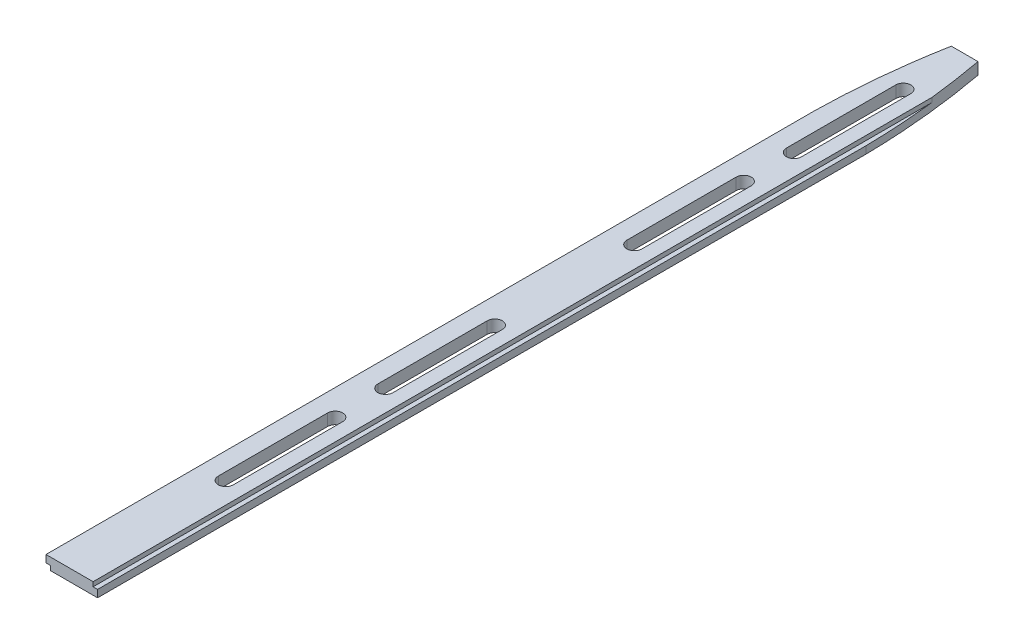
ISO-10303-21;
HEADER;
FILE_DESCRIPTION(('STEP AP214'),'2;1');
FILE_NAME('part.step','',(''),(''),'','','');
FILE_SCHEMA(('AUTOMOTIVE_DESIGN { 1 0 10303 214 1 1 1 1 }'));
ENDSEC;
DATA;
#1=APPLICATION_CONTEXT('core data for automotive mechanical design processes');
#2=APPLICATION_PROTOCOL_DEFINITION('international standard','automotive_design',2000,#1);
#3=PRODUCT_CONTEXT('',#1,'mechanical');
#4=PRODUCT('Part','Part','',(#3));
#5=PRODUCT_RELATED_PRODUCT_CATEGORY('part','',(#4));
#6=PRODUCT_DEFINITION_FORMATION('','',#4);
#7=PRODUCT_DEFINITION_CONTEXT('part definition',#1,'design');
#8=PRODUCT_DEFINITION('design','',#6,#7);
#9=PRODUCT_DEFINITION_SHAPE('','',#8);
#10=(LENGTH_UNIT() NAMED_UNIT(*) SI_UNIT(.MILLI.,.METRE.));
#11=(NAMED_UNIT(*) PLANE_ANGLE_UNIT() SI_UNIT($,.RADIAN.));
#12=(NAMED_UNIT(*) SI_UNIT($,.STERADIAN.) SOLID_ANGLE_UNIT());
#13=UNCERTAINTY_MEASURE_WITH_UNIT(LENGTH_MEASURE(1.E-05),#10,'distance_accuracy_value','');
#14=(GEOMETRIC_REPRESENTATION_CONTEXT(3) GLOBAL_UNCERTAINTY_ASSIGNED_CONTEXT((#13)) GLOBAL_UNIT_ASSIGNED_CONTEXT((#10,
#11,#12)) REPRESENTATION_CONTEXT('',''));
#15=CARTESIAN_POINT('',(0.,0.,0.));
#16=DIRECTION('',(0.,0.,1.));
#17=DIRECTION('',(1.,0.,0.));
#18=AXIS2_PLACEMENT_3D('',#15,#16,#17);
#19=CARTESIAN_POINT('',(0.,0.,401.7));
#20=DIRECTION('',(1.,0.,0.));
#21=DIRECTION('',(0.,0.,-1.));
#22=AXIS2_PLACEMENT_3D('',#19,#20,#21);
#23=PLANE('',#22);
#24=DIRECTION('',(0.,0.,1.));
#25=VECTOR('',#24,1.);
#26=CARTESIAN_POINT('',(0.,6.3,-1.));
#27=LINE('',#26,#25);
#28=CARTESIAN_POINT('',(0.,6.3,56.));
#29=VERTEX_POINT('',#28);
#30=CARTESIAN_POINT('',(0.,6.3,401.7));
#31=VERTEX_POINT('',#30);
#32=EDGE_CURVE('E496',#29,#31,#27,.T.);
#33=ORIENTED_EDGE('',*,*,#32,.F.);
#34=DIRECTION('',(0.,1.,0.));
#35=VECTOR('',#34,1.);
#36=CARTESIAN_POINT('',(0.,-396.4,56.));
#37=LINE('',#36,#35);
#38=CARTESIAN_POINT('',(0.,3.,56.));
#39=VERTEX_POINT('',#38);
#40=EDGE_CURVE('E442',#39,#29,#37,.T.);
#41=ORIENTED_EDGE('',*,*,#40,.F.);
#42=DIRECTION('',(0.,0.,1.));
#43=VECTOR('',#42,1.);
#44=CARTESIAN_POINT('',(0.,3.,-1.));
#45=LINE('',#44,#43);
#46=CARTESIAN_POINT('',(0.,3.,401.7));
#47=VERTEX_POINT('',#46);
#48=EDGE_CURVE('E479',#39,#47,#45,.T.);
#49=ORIENTED_EDGE('',*,*,#48,.T.);
#50=DIRECTION('',(0.,-1.,0.));
#51=VECTOR('',#50,1.);
#52=CARTESIAN_POINT('',(0.,0.,401.7));
#53=LINE('',#52,#51);
#54=EDGE_CURVE('E500',#31,#47,#53,.T.);
#55=ORIENTED_EDGE('',*,*,#54,.F.);
#56=EDGE_LOOP('',(#33,#41,#49,#55));
#57=FACE_BOUND('',#56,.T.);
#58=ADVANCED_FACE('F43',(#57),#23,.F.);
#59=CARTESIAN_POINT('',(23.2,0.,401.7));
#60=DIRECTION('',(-1.,0.,0.));
#61=DIRECTION('',(0.,0.,1.));
#62=AXIS2_PLACEMENT_3D('',#59,#60,#61);
#63=PLANE('',#62);
#64=DIRECTION('',(0.,0.,1.));
#65=VECTOR('',#64,1.);
#66=CARTESIAN_POINT('',(23.2,1.,-1.));
#67=LINE('',#66,#65);
#68=CARTESIAN_POINT('',(23.2,1.,56.));
#69=VERTEX_POINT('',#68);
#70=CARTESIAN_POINT('',(23.2,1.,401.7));
#71=VERTEX_POINT('',#70);
#72=EDGE_CURVE('E509',#69,#71,#67,.T.);
#73=ORIENTED_EDGE('',*,*,#72,.F.);
#74=DIRECTION('',(0.,1.,0.));
#75=VECTOR('',#74,1.);
#76=CARTESIAN_POINT('',(23.2,-396.4,56.));
#77=LINE('',#76,#75);
#78=CARTESIAN_POINT('',(23.2,4.30000000000003,56.));
#79=VERTEX_POINT('',#78);
#80=EDGE_CURVE('E552',#69,#79,#77,.T.);
#81=ORIENTED_EDGE('',*,*,#80,.T.);
#82=DIRECTION('',(0.,0.,1.));
#83=VECTOR('',#82,1.);
#84=CARTESIAN_POINT('',(23.2,4.3,-1.));
#85=LINE('',#84,#83);
#86=CARTESIAN_POINT('',(23.2,4.3,401.7));
#87=VERTEX_POINT('',#86);
#88=EDGE_CURVE('E497',#79,#87,#85,.T.);
#89=ORIENTED_EDGE('',*,*,#88,.T.);
#90=DIRECTION('',(0.,1.,0.));
#91=VECTOR('',#90,1.);
#92=CARTESIAN_POINT('',(23.2,0.,401.7));
#93=LINE('',#92,#91);
#94=EDGE_CURVE('E534',#71,#87,#93,.T.);
#95=ORIENTED_EDGE('',*,*,#94,.F.);
#96=EDGE_LOOP('',(#73,#81,#89,#95));
#97=FACE_BOUND('',#96,.T.);
#98=ADVANCED_FACE('F582',(#97),#63,.F.);
#99=CARTESIAN_POINT('',(0.,0.,401.7));
#100=DIRECTION('',(0.,0.,-1.));
#101=DIRECTION('',(-1.,0.,0.));
#102=AXIS2_PLACEMENT_3D('',#99,#100,#101);
#103=PLANE('',#102);
#104=ORIENTED_EDGE('',*,*,#94,.T.);
#105=DIRECTION('',(1.,0.,0.));
#106=VECTOR('',#105,1.);
#107=CARTESIAN_POINT('',(21.2,4.3,401.7));
#108=LINE('',#107,#106);
#109=CARTESIAN_POINT('',(21.2,4.3,401.7));
#110=VERTEX_POINT('',#109);
#111=EDGE_CURVE('E492',#110,#87,#108,.T.);
#112=ORIENTED_EDGE('',*,*,#111,.F.);
#113=DIRECTION('',(0.,-1.,0.));
#114=VECTOR('',#113,1.);
#115=CARTESIAN_POINT('',(21.2,6.3,401.7));
#116=LINE('',#115,#114);
#117=CARTESIAN_POINT('',(21.2,6.3,401.7));
#118=VERTEX_POINT('',#117);
#119=EDGE_CURVE('E487',#118,#110,#116,.T.);
#120=ORIENTED_EDGE('',*,*,#119,.F.);
#121=DIRECTION('',(1.,0.,0.));
#122=VECTOR('',#121,1.);
#123=CARTESIAN_POINT('',(0.,6.3,401.7));
#124=LINE('',#123,#122);
#125=EDGE_CURVE('E480',#31,#118,#124,.T.);
#126=ORIENTED_EDGE('',*,*,#125,.F.);
#127=ORIENTED_EDGE('',*,*,#54,.T.);
#128=DIRECTION('',(-1.,0.,0.));
#129=VECTOR('',#128,1.);
#130=CARTESIAN_POINT('',(0.,3.,401.7));
#131=LINE('',#130,#129);
#132=CARTESIAN_POINT('',(2.,3.,401.7));
#133=VERTEX_POINT('',#132);
#134=EDGE_CURVE('E512',#133,#47,#131,.T.);
#135=ORIENTED_EDGE('',*,*,#134,.F.);
#136=DIRECTION('',(0.,1.,0.));
#137=VECTOR('',#136,1.);
#138=CARTESIAN_POINT('',(2.,0.999999999999997,401.7));
#139=LINE('',#138,#137);
#140=CARTESIAN_POINT('',(2.,0.999999999999997,401.7));
#141=VERTEX_POINT('',#140);
#142=EDGE_CURVE('E524',#141,#133,#139,.T.);
#143=ORIENTED_EDGE('',*,*,#142,.F.);
#144=DIRECTION('',(-1.,0.,0.));
#145=VECTOR('',#144,1.);
#146=CARTESIAN_POINT('',(23.2,1.,401.7));
#147=LINE('',#146,#145);
#148=EDGE_CURVE('E488',#71,#141,#147,.T.);
#149=ORIENTED_EDGE('',*,*,#148,.F.);
#150=EDGE_LOOP('',(#104,#112,#120,#126,#127,#135,#143,#149));
#151=FACE_BOUND('',#150,.T.);
#152=ADVANCED_FACE('F570',(#151),#103,.F.);
#153=CARTESIAN_POINT('',(0.,0.,0.));
#154=DIRECTION('',(0.,0.,-1.));
#155=DIRECTION('',(-1.,0.,0.));
#156=AXIS2_PLACEMENT_3D('',#153,#154,#155);
#157=PLANE('',#156);
#158=DIRECTION('',(0.,1.,0.));
#159=VECTOR('',#158,1.);
#160=CARTESIAN_POINT('',(5.6,-396.4,0.));
#161=LINE('',#160,#159);
#162=CARTESIAN_POINT('',(5.6,1.,0.));
#163=VERTEX_POINT('',#162);
#164=CARTESIAN_POINT('',(5.6,6.3,0.));
#165=VERTEX_POINT('',#164);
#166=EDGE_CURVE('E549',#163,#165,#161,.T.);
#167=ORIENTED_EDGE('',*,*,#166,.T.);
#168=DIRECTION('',(-1.,0.,0.));
#169=VECTOR('',#168,1.);
#170=CARTESIAN_POINT('',(0.,6.3,0.));
#171=LINE('',#170,#169);
#172=CARTESIAN_POINT('',(17.6,6.3,0.));
#173=VERTEX_POINT('',#172);
#174=EDGE_CURVE('E11',#173,#165,#171,.T.);
#175=ORIENTED_EDGE('',*,*,#174,.F.);
#176=DIRECTION('',(0.,1.,0.));
#177=VECTOR('',#176,1.);
#178=CARTESIAN_POINT('',(17.6,-396.4,0.));
#179=LINE('',#178,#177);
#180=CARTESIAN_POINT('',(17.6,1.,0.));
#181=VERTEX_POINT('',#180);
#182=EDGE_CURVE('E397',#181,#173,#179,.T.);
#183=ORIENTED_EDGE('',*,*,#182,.F.);
#184=DIRECTION('',(1.,0.,0.));
#185=VECTOR('',#184,1.);
#186=CARTESIAN_POINT('',(0.,0.999999999999997,0.));
#187=LINE('',#186,#185);
#188=EDGE_CURVE('E51',#163,#181,#187,.T.);
#189=ORIENTED_EDGE('',*,*,#188,.F.);
#190=EDGE_LOOP('',(#167,#175,#183,#189));
#191=FACE_BOUND('',#190,.T.);
#192=ADVANCED_FACE('F547',(#191),#157,.T.);
#193=CARTESIAN_POINT('',(0.,3.,-1.));
#194=DIRECTION('',(0.,1.,0.));
#195=DIRECTION('',(0.,0.,1.));
#196=AXIS2_PLACEMENT_3D('',#193,#194,#195);
#197=PLANE('',#196);
#198=ORIENTED_EDGE('',*,*,#48,.F.);
#199=CARTESIAN_POINT('',(0.,3.,56.));
#200=CARTESIAN_POINT('',(0.420625120228415,3.,27.8813271999908));
#201=CARTESIAN_POINT('',(5.6,3.,0.));
#202=B_SPLINE_CURVE_WITH_KNOTS('',2,(#199,#200,#201),.UNSPECIFIED.,.F.,.F.,(3,3),(0.,
0.849776742775546),.UNSPECIFIED.);
#203=CARTESIAN_POINT('',(1.99999999999958,3.,24.2514642715801));
#204=VERTEX_POINT('',#203);
#205=EDGE_CURVE('E473',#39,#204,#202,.T.);
#206=ORIENTED_EDGE('',*,*,#205,.T.);
#207=DIRECTION('',(0.,0.,1.));
#208=VECTOR('',#207,1.);
#209=CARTESIAN_POINT('',(2.,3.,-1.));
#210=LINE('',#209,#208);
#211=EDGE_CURVE('E516',#204,#133,#210,.T.);
#212=ORIENTED_EDGE('',*,*,#211,.T.);
#213=ORIENTED_EDGE('',*,*,#134,.T.);
#214=EDGE_LOOP('',(#198,#206,#212,#213));
#215=FACE_BOUND('',#214,.T.);
#216=ADVANCED_FACE('F588',(#215),#197,.F.);
#217=CARTESIAN_POINT('',(2.,0.999999999999997,-1.));
#218=DIRECTION('',(1.,0.,0.));
#219=DIRECTION('',(0.,1.,0.));
#220=AXIS2_PLACEMENT_3D('',#217,#218,#219);
#221=PLANE('',#220);
#222=ORIENTED_EDGE('',*,*,#211,.F.);
#223=DIRECTION('',(0.,1.,0.));
#224=VECTOR('',#223,1.);
#225=CARTESIAN_POINT('',(1.99999999999958,-396.4,24.2514642715801));
#226=LINE('',#225,#224);
#227=CARTESIAN_POINT('',(1.99999999768843,1.,24.2514642923522));
#228=VERTEX_POINT('',#227);
#229=EDGE_CURVE('E466',#204,#228,#226,.F.);
#230=ORIENTED_EDGE('',*,*,#229,.T.);
#231=DIRECTION('',(0.,0.,1.));
#232=VECTOR('',#231,1.);
#233=CARTESIAN_POINT('',(2.,0.999999999999997,-1.));
#234=LINE('',#233,#232);
#235=EDGE_CURVE('E513',#228,#141,#234,.T.);
#236=ORIENTED_EDGE('',*,*,#235,.T.);
#237=ORIENTED_EDGE('',*,*,#142,.T.);
#238=EDGE_LOOP('',(#222,#230,#236,#237));
#239=FACE_BOUND('',#238,.T.);
#240=ADVANCED_FACE('F586',(#239),#221,.F.);
#241=CARTESIAN_POINT('',(23.2,1.,-1.));
#242=DIRECTION('',(0.,1.,0.));
#243=DIRECTION('',(-1.,0.,0.));
#244=AXIS2_PLACEMENT_3D('',#241,#242,#243);
#245=PLANE('',#244);
#246=DIRECTION('',(0.,0.,-1.));
#247=VECTOR('',#246,1.);
#248=CARTESIAN_POINT('',(15.,0.999999999999999,-1.));
#249=LINE('',#248,#247);
#250=CARTESIAN_POINT('',(15.,1.,76.8));
#251=VERTEX_POINT('',#250);
#252=CARTESIAN_POINT('',(15.,1.,27.6));
#253=VERTEX_POINT('',#252);
#254=EDGE_CURVE('E389',#251,#253,#249,.T.);
#255=ORIENTED_EDGE('',*,*,#254,.T.);
#256=CARTESIAN_POINT('',(11.6,1.,27.6));
#257=DIRECTION('',(0.,1.,0.));
#258=DIRECTION('',(-1.,0.,0.));
#259=AXIS2_PLACEMENT_3D('',#256,#257,#258);
#260=CIRCLE('',#259,3.4);
#261=CARTESIAN_POINT('',(8.2,1.,27.6));
#262=VERTEX_POINT('',#261);
#263=EDGE_CURVE('E393',#253,#262,#260,.T.);
#264=ORIENTED_EDGE('',*,*,#263,.T.);
#265=DIRECTION('',(0.,0.,1.));
#266=VECTOR('',#265,1.);
#267=CARTESIAN_POINT('',(8.2,0.999999999999998,-1.));
#268=LINE('',#267,#266);
#269=CARTESIAN_POINT('',(8.2,0.999999999999998,76.8));
#270=VERTEX_POINT('',#269);
#271=EDGE_CURVE('E384',#262,#270,#268,.T.);
#272=ORIENTED_EDGE('',*,*,#271,.T.);
#273=CARTESIAN_POINT('',(11.6,1.,76.8));
#274=DIRECTION('',(0.,1.,0.));
#275=DIRECTION('',(-1.,0.,0.));
#276=AXIS2_PLACEMENT_3D('',#273,#274,#275);
#277=CIRCLE('',#276,3.4);
#278=EDGE_CURVE('E221',#270,#251,#277,.T.);
#279=ORIENTED_EDGE('',*,*,#278,.T.);
#280=EDGE_LOOP('',(#255,#264,#272,#279));
#281=FACE_BOUND('',#280,.T.);
#282=DIRECTION('',(0.,0.,-1.));
#283=VECTOR('',#282,1.);
#284=CARTESIAN_POINT('',(15.,0.999999999999999,-0.999999999999999));
#285=LINE('',#284,#283);
#286=CARTESIAN_POINT('',(15.,1.,148.6));
#287=VERTEX_POINT('',#286);
#288=CARTESIAN_POINT('',(15.,1.,99.4));
#289=VERTEX_POINT('',#288);
#290=EDGE_CURVE('E376',#287,#289,#285,.T.);
#291=ORIENTED_EDGE('',*,*,#290,.T.);
#292=CARTESIAN_POINT('',(11.6,1.,99.4));
#293=DIRECTION('',(0.,1.,0.));
#294=DIRECTION('',(-1.,0.,0.));
#295=AXIS2_PLACEMENT_3D('',#292,#293,#294);
#296=CIRCLE('',#295,3.4);
#297=CARTESIAN_POINT('',(8.2,1.,99.4));
#298=VERTEX_POINT('',#297);
#299=EDGE_CURVE('E380',#289,#298,#296,.T.);
#300=ORIENTED_EDGE('',*,*,#299,.T.);
#301=DIRECTION('',(0.,0.,1.));
#302=VECTOR('',#301,1.);
#303=CARTESIAN_POINT('',(8.20000000000001,0.999999999999998,-1.));
#304=LINE('',#303,#302);
#305=CARTESIAN_POINT('',(8.2,0.999999999999998,148.6));
#306=VERTEX_POINT('',#305);
#307=EDGE_CURVE('E368',#298,#306,#304,.T.);
#308=ORIENTED_EDGE('',*,*,#307,.T.);
#309=CARTESIAN_POINT('',(11.6,1.,148.6));
#310=DIRECTION('',(0.,1.,0.));
#311=DIRECTION('',(-1.,0.,0.));
#312=AXIS2_PLACEMENT_3D('',#309,#310,#311);
#313=CIRCLE('',#312,3.40000000000001);
#314=EDGE_CURVE('E372',#306,#287,#313,.T.);
#315=ORIENTED_EDGE('',*,*,#314,.T.);
#316=EDGE_LOOP('',(#291,#300,#308,#315));
#317=FACE_BOUND('',#316,.T.);
#318=DIRECTION('',(0.,0.,-1.));
#319=VECTOR('',#318,1.);
#320=CARTESIAN_POINT('',(15.,0.999999999999999,-1.));
#321=LINE('',#320,#319);
#322=CARTESIAN_POINT('',(15.,1.,260.6));
#323=VERTEX_POINT('',#322);
#324=CARTESIAN_POINT('',(15.,1.,211.4));
#325=VERTEX_POINT('',#324);
#326=EDGE_CURVE('E360',#323,#325,#321,.T.);
#327=ORIENTED_EDGE('',*,*,#326,.T.);
#328=CARTESIAN_POINT('',(11.6,1.,211.4));
#329=DIRECTION('',(0.,1.,0.));
#330=DIRECTION('',(-1.,0.,0.));
#331=AXIS2_PLACEMENT_3D('',#328,#329,#330);
#332=CIRCLE('',#331,3.40000000000001);
#333=CARTESIAN_POINT('',(8.2,1.,211.4));
#334=VERTEX_POINT('',#333);
#335=EDGE_CURVE('E364',#325,#334,#332,.T.);
#336=ORIENTED_EDGE('',*,*,#335,.T.);
#337=DIRECTION('',(0.,0.,1.));
#338=VECTOR('',#337,1.);
#339=CARTESIAN_POINT('',(8.2,0.999999999999998,-1.));
#340=LINE('',#339,#338);
#341=CARTESIAN_POINT('',(8.2,0.999999999999998,260.6));
#342=VERTEX_POINT('',#341);
#343=EDGE_CURVE('E352',#334,#342,#340,.T.);
#344=ORIENTED_EDGE('',*,*,#343,.T.);
#345=CARTESIAN_POINT('',(11.6,1.,260.6));
#346=DIRECTION('',(0.,1.,0.));
#347=DIRECTION('',(-1.,0.,0.));
#348=AXIS2_PLACEMENT_3D('',#345,#346,#347);
#349=CIRCLE('',#348,3.40000000000001);
#350=EDGE_CURVE('E356',#342,#323,#349,.T.);
#351=ORIENTED_EDGE('',*,*,#350,.T.);
#352=EDGE_LOOP('',(#327,#336,#344,#351));
#353=FACE_BOUND('',#352,.T.);
#354=DIRECTION('',(0.,0.,-1.));
#355=VECTOR('',#354,1.);
#356=CARTESIAN_POINT('',(15.,0.999999999999999,-1.));
#357=LINE('',#356,#355);
#358=CARTESIAN_POINT('',(15.,1.,332.4));
#359=VERTEX_POINT('',#358);
#360=CARTESIAN_POINT('',(15.,1.,283.2));
#361=VERTEX_POINT('',#360);
#362=EDGE_CURVE('E344',#359,#361,#357,.T.);
#363=ORIENTED_EDGE('',*,*,#362,.T.);
#364=CARTESIAN_POINT('',(11.6,1.,283.2));
#365=DIRECTION('',(0.,1.,0.));
#366=DIRECTION('',(-1.,0.,0.));
#367=AXIS2_PLACEMENT_3D('',#364,#365,#366);
#368=CIRCLE('',#367,3.40000000000001);
#369=CARTESIAN_POINT('',(8.2,1.,283.2));
#370=VERTEX_POINT('',#369);
#371=EDGE_CURVE('E348',#361,#370,#368,.T.);
#372=ORIENTED_EDGE('',*,*,#371,.T.);
#373=DIRECTION('',(0.,0.,1.));
#374=VECTOR('',#373,1.);
#375=CARTESIAN_POINT('',(8.2,0.999999999999998,-1.));
#376=LINE('',#375,#374);
#377=CARTESIAN_POINT('',(8.2,0.999999999999998,332.4));
#378=VERTEX_POINT('',#377);
#379=EDGE_CURVE('E250',#370,#378,#376,.T.);
#380=ORIENTED_EDGE('',*,*,#379,.T.);
#381=CARTESIAN_POINT('',(11.6,1.,332.4));
#382=DIRECTION('',(0.,1.,0.));
#383=DIRECTION('',(-1.,0.,0.));
#384=AXIS2_PLACEMENT_3D('',#381,#382,#383);
#385=CIRCLE('',#384,3.40000000000001);
#386=EDGE_CURVE('E340',#378,#359,#385,.T.);
#387=ORIENTED_EDGE('',*,*,#386,.T.);
#388=EDGE_LOOP('',(#363,#372,#380,#387));
#389=FACE_BOUND('',#388,.T.);
#390=ORIENTED_EDGE('',*,*,#235,.F.);
#391=CARTESIAN_POINT('',(0.,1.,56.));
#392=CARTESIAN_POINT('',(0.420625120228415,1.,27.8813271999908));
#393=CARTESIAN_POINT('',(5.6,1.,0.));
#394=B_SPLINE_CURVE_WITH_KNOTS('',2,(#391,#392,#393),.UNSPECIFIED.,.F.,.F.,(3,3),(0.,
0.849776742775546),.UNSPECIFIED.);
#395=EDGE_CURVE('E457',#228,#163,#394,.T.);
#396=ORIENTED_EDGE('',*,*,#395,.T.);
#397=ORIENTED_EDGE('',*,*,#188,.T.);
#398=CARTESIAN_POINT('',(17.6,1.,0.));
#399=CARTESIAN_POINT('',(22.7793748797716,1.,27.8813271999908));
#400=CARTESIAN_POINT('',(23.2,1.,56.));
#401=B_SPLINE_CURVE_WITH_KNOTS('',2,(#398,#399,#400),.UNSPECIFIED.,.F.,.F.,(3,3),(0.,
0.849776742775546),.UNSPECIFIED.);
#402=EDGE_CURVE('E448',#181,#69,#401,.T.);
#403=ORIENTED_EDGE('',*,*,#402,.T.);
#404=ORIENTED_EDGE('',*,*,#72,.T.);
#405=ORIENTED_EDGE('',*,*,#148,.T.);
#406=EDGE_LOOP('',(#390,#396,#397,#403,#404,#405));
#407=FACE_BOUND('',#406,.T.);
#408=ADVANCED_FACE('F542',(#281,#317,#353,#389,#407),#245,.F.);
#409=CARTESIAN_POINT('',(21.2,4.3,-1.));
#410=DIRECTION('',(0.,-1.,0.));
#411=DIRECTION('',(0.,0.,-1.));
#412=AXIS2_PLACEMENT_3D('',#409,#410,#411);
#413=PLANE('',#412);
#414=ORIENTED_EDGE('',*,*,#88,.F.);
#415=CARTESIAN_POINT('',(17.6,4.30000000000003,0.));
#416=CARTESIAN_POINT('',(22.7793748797716,4.30000000000003,27.8813271999908));
#417=CARTESIAN_POINT('',(23.2,4.30000000000003,56.));
#418=B_SPLINE_CURVE_WITH_KNOTS('',2,(#415,#416,#417),.UNSPECIFIED.,.F.,.F.,(3,3),(0.,
0.849776742775546),.UNSPECIFIED.);
#419=CARTESIAN_POINT('',(21.2,4.30000000000003,24.2514642715762));
#420=VERTEX_POINT('',#419);
#421=EDGE_CURVE('E441',#79,#420,#418,.F.);
#422=ORIENTED_EDGE('',*,*,#421,.T.);
#423=DIRECTION('',(0.,0.,1.));
#424=VECTOR('',#423,1.);
#425=CARTESIAN_POINT('',(21.2,4.3,-1.));
#426=LINE('',#425,#424);
#427=EDGE_CURVE('E501',#420,#110,#426,.T.);
#428=ORIENTED_EDGE('',*,*,#427,.T.);
#429=ORIENTED_EDGE('',*,*,#111,.T.);
#430=EDGE_LOOP('',(#414,#422,#428,#429));
#431=FACE_BOUND('',#430,.T.);
#432=ADVANCED_FACE('F423',(#431),#413,.F.);
#433=CARTESIAN_POINT('',(21.2,6.3,-1.));
#434=DIRECTION('',(-1.,0.,0.));
#435=DIRECTION('',(0.,0.,1.));
#436=AXIS2_PLACEMENT_3D('',#433,#434,#435);
#437=PLANE('',#436);
#438=ORIENTED_EDGE('',*,*,#427,.F.);
#439=DIRECTION('',(0.,1.,0.));
#440=VECTOR('',#439,1.);
#441=CARTESIAN_POINT('',(21.2,-396.4,24.2514642715762));
#442=LINE('',#441,#440);
#443=CARTESIAN_POINT('',(21.2000000023116,6.3,24.2514642923522));
#444=VERTEX_POINT('',#443);
#445=EDGE_CURVE('E434',#420,#444,#442,.T.);
#446=ORIENTED_EDGE('',*,*,#445,.T.);
#447=DIRECTION('',(0.,0.,1.));
#448=VECTOR('',#447,1.);
#449=CARTESIAN_POINT('',(21.2,6.3,-1.));
#450=LINE('',#449,#448);
#451=EDGE_CURVE('E504',#444,#118,#450,.T.);
#452=ORIENTED_EDGE('',*,*,#451,.T.);
#453=ORIENTED_EDGE('',*,*,#119,.T.);
#454=EDGE_LOOP('',(#438,#446,#452,#453));
#455=FACE_BOUND('',#454,.T.);
#456=ADVANCED_FACE('F577',(#455),#437,.F.);
#457=CARTESIAN_POINT('',(0.,6.3,-1.));
#458=DIRECTION('',(0.,-1.,0.));
#459=DIRECTION('',(0.,0.,-1.));
#460=AXIS2_PLACEMENT_3D('',#457,#458,#459);
#461=PLANE('',#460);
#462=DIRECTION('',(0.,0.,1.));
#463=VECTOR('',#462,1.);
#464=CARTESIAN_POINT('',(8.2,6.3,27.6));
#465=LINE('',#464,#463);
#466=CARTESIAN_POINT('',(8.2,6.3,27.6));
#467=VERTEX_POINT('',#466);
#468=CARTESIAN_POINT('',(8.2,6.3,76.8));
#469=VERTEX_POINT('',#468);
#470=EDGE_CURVE('E229',#467,#469,#465,.T.);
#471=ORIENTED_EDGE('',*,*,#470,.F.);
#472=CARTESIAN_POINT('',(11.6,6.3,27.6));
#473=DIRECTION('',(0.,1.,0.));
#474=DIRECTION('',(0.,0.,1.));
#475=AXIS2_PLACEMENT_3D('',#472,#473,#474);
#476=CIRCLE('',#475,3.4);
#477=CARTESIAN_POINT('',(15.,6.3,27.6));
#478=VERTEX_POINT('',#477);
#479=EDGE_CURVE('E235',#478,#467,#476,.T.);
#480=ORIENTED_EDGE('',*,*,#479,.F.);
#481=DIRECTION('',(0.,0.,-1.));
#482=VECTOR('',#481,1.);
#483=CARTESIAN_POINT('',(15.,6.3,27.6));
#484=LINE('',#483,#482);
#485=CARTESIAN_POINT('',(15.,6.3,76.8));
#486=VERTEX_POINT('',#485);
#487=EDGE_CURVE('E240',#486,#478,#484,.T.);
#488=ORIENTED_EDGE('',*,*,#487,.F.);
#489=CARTESIAN_POINT('',(11.6,6.3,76.8));
#490=DIRECTION('',(0.,1.,0.));
#491=DIRECTION('',(0.,0.,1.));
#492=AXIS2_PLACEMENT_3D('',#489,#490,#491);
#493=CIRCLE('',#492,3.4);
#494=EDGE_CURVE('E218',#469,#486,#493,.T.);
#495=ORIENTED_EDGE('',*,*,#494,.F.);
#496=EDGE_LOOP('',(#471,#480,#488,#495));
#497=FACE_BOUND('',#496,.T.);
#498=DIRECTION('',(0.,0.,1.));
#499=VECTOR('',#498,1.);
#500=CARTESIAN_POINT('',(8.2,6.3,99.4));
#501=LINE('',#500,#499);
#502=CARTESIAN_POINT('',(8.2,6.3,99.4));
#503=VERTEX_POINT('',#502);
#504=CARTESIAN_POINT('',(8.2,6.3,148.6));
#505=VERTEX_POINT('',#504);
#506=EDGE_CURVE('E276',#503,#505,#501,.T.);
#507=ORIENTED_EDGE('',*,*,#506,.F.);
#508=CARTESIAN_POINT('',(11.6,6.3,99.4));
#509=DIRECTION('',(0.,1.,0.));
#510=DIRECTION('',(0.,0.,1.));
#511=AXIS2_PLACEMENT_3D('',#508,#509,#510);
#512=CIRCLE('',#511,3.4);
#513=CARTESIAN_POINT('',(15.,6.3,99.4));
#514=VERTEX_POINT('',#513);
#515=EDGE_CURVE('E279',#514,#503,#512,.T.);
#516=ORIENTED_EDGE('',*,*,#515,.F.);
#517=DIRECTION('',(0.,0.,-1.));
#518=VECTOR('',#517,1.);
#519=CARTESIAN_POINT('',(15.,6.3,99.4));
#520=LINE('',#519,#518);
#521=CARTESIAN_POINT('',(15.,6.3,148.6));
#522=VERTEX_POINT('',#521);
#523=EDGE_CURVE('E259',#522,#514,#520,.T.);
#524=ORIENTED_EDGE('',*,*,#523,.F.);
#525=CARTESIAN_POINT('',(11.6,6.3,148.6));
#526=DIRECTION('',(0.,1.,0.));
#527=DIRECTION('',(0.,0.,1.));
#528=AXIS2_PLACEMENT_3D('',#525,#526,#527);
#529=CIRCLE('',#528,3.40000000000001);
#530=EDGE_CURVE('E272',#505,#522,#529,.T.);
#531=ORIENTED_EDGE('',*,*,#530,.F.);
#532=EDGE_LOOP('',(#507,#516,#524,#531));
#533=FACE_BOUND('',#532,.T.);
#534=DIRECTION('',(0.,0.,1.));
#535=VECTOR('',#534,1.);
#536=CARTESIAN_POINT('',(8.2,6.3,211.4));
#537=LINE('',#536,#535);
#538=CARTESIAN_POINT('',(8.2,6.3,211.4));
#539=VERTEX_POINT('',#538);
#540=CARTESIAN_POINT('',(8.2,6.3,260.6));
#541=VERTEX_POINT('',#540);
#542=EDGE_CURVE('E304',#539,#541,#537,.T.);
#543=ORIENTED_EDGE('',*,*,#542,.F.);
#544=CARTESIAN_POINT('',(11.6,6.3,211.4));
#545=DIRECTION('',(0.,1.,0.));
#546=DIRECTION('',(0.,0.,1.));
#547=AXIS2_PLACEMENT_3D('',#544,#545,#546);
#548=CIRCLE('',#547,3.40000000000001);
#549=CARTESIAN_POINT('',(15.,6.3,211.4));
#550=VERTEX_POINT('',#549);
#551=EDGE_CURVE('E268',#550,#539,#548,.T.);
#552=ORIENTED_EDGE('',*,*,#551,.F.);
#553=DIRECTION('',(0.,0.,-1.));
#554=VECTOR('',#553,1.);
#555=CARTESIAN_POINT('',(15.,6.3,211.4));
#556=LINE('',#555,#554);
#557=CARTESIAN_POINT('',(15.,6.3,260.6));
#558=VERTEX_POINT('',#557);
#559=EDGE_CURVE('E286',#558,#550,#556,.T.);
#560=ORIENTED_EDGE('',*,*,#559,.F.);
#561=CARTESIAN_POINT('',(11.6,6.3,260.6));
#562=DIRECTION('',(0.,1.,0.));
#563=DIRECTION('',(0.,0.,1.));
#564=AXIS2_PLACEMENT_3D('',#561,#562,#563);
#565=CIRCLE('',#564,3.40000000000001);
#566=EDGE_CURVE('E300',#541,#558,#565,.T.);
#567=ORIENTED_EDGE('',*,*,#566,.F.);
#568=EDGE_LOOP('',(#543,#552,#560,#567));
#569=FACE_BOUND('',#568,.T.);
#570=DIRECTION('',(0.,0.,1.));
#571=VECTOR('',#570,1.);
#572=CARTESIAN_POINT('',(8.2,6.3,283.2));
#573=LINE('',#572,#571);
#574=CARTESIAN_POINT('',(8.2,6.3,283.2));
#575=VERTEX_POINT('',#574);
#576=CARTESIAN_POINT('',(8.2,6.3,332.4));
#577=VERTEX_POINT('',#576);
#578=EDGE_CURVE('E331',#575,#577,#573,.T.);
#579=ORIENTED_EDGE('',*,*,#578,.F.);
#580=CARTESIAN_POINT('',(11.6,6.3,283.2));
#581=DIRECTION('',(0.,1.,0.));
#582=DIRECTION('',(0.,0.,1.));
#583=AXIS2_PLACEMENT_3D('',#580,#581,#582);
#584=CIRCLE('',#583,3.40000000000001);
#585=CARTESIAN_POINT('',(15.,6.3,283.2));
#586=VERTEX_POINT('',#585);
#587=EDGE_CURVE('E296',#586,#575,#584,.T.);
#588=ORIENTED_EDGE('',*,*,#587,.F.);
#589=DIRECTION('',(0.,0.,-1.));
#590=VECTOR('',#589,1.);
#591=CARTESIAN_POINT('',(15.,6.3,283.2));
#592=LINE('',#591,#590);
#593=CARTESIAN_POINT('',(15.,6.3,332.4));
#594=VERTEX_POINT('',#593);
#595=EDGE_CURVE('E314',#594,#586,#592,.T.);
#596=ORIENTED_EDGE('',*,*,#595,.F.);
#597=CARTESIAN_POINT('',(11.6,6.3,332.4));
#598=DIRECTION('',(0.,1.,0.));
#599=DIRECTION('',(0.,0.,1.));
#600=AXIS2_PLACEMENT_3D('',#597,#598,#599);
#601=CIRCLE('',#600,3.40000000000001);
#602=EDGE_CURVE('E327',#577,#594,#601,.T.);
#603=ORIENTED_EDGE('',*,*,#602,.F.);
#604=EDGE_LOOP('',(#579,#588,#596,#603));
#605=FACE_BOUND('',#604,.T.);
#606=ORIENTED_EDGE('',*,*,#174,.T.);
#607=CARTESIAN_POINT('',(0.,6.3,56.));
#608=CARTESIAN_POINT('',(0.420625120228415,6.3,27.8813271999908));
#609=CARTESIAN_POINT('',(5.6,6.3,0.));
#610=B_SPLINE_CURVE_WITH_KNOTS('',2,(#607,#608,#609),.UNSPECIFIED.,.F.,.F.,(3,3),(0.,
0.849776742775546),.UNSPECIFIED.);
#611=EDGE_CURVE('E402',#29,#165,#610,.T.);
#612=ORIENTED_EDGE('',*,*,#611,.F.);
#613=ORIENTED_EDGE('',*,*,#32,.T.);
#614=ORIENTED_EDGE('',*,*,#125,.T.);
#615=ORIENTED_EDGE('',*,*,#451,.F.);
#616=CARTESIAN_POINT('',(17.6,6.3,0.));
#617=CARTESIAN_POINT('',(22.7793748797716,6.3,27.8813271999908));
#618=CARTESIAN_POINT('',(23.2,6.3,56.));
#619=B_SPLINE_CURVE_WITH_KNOTS('',2,(#616,#617,#618),.UNSPECIFIED.,.F.,.F.,(3,3),(0.,
0.849776742775546),.UNSPECIFIED.);
#620=EDGE_CURVE('E430',#173,#444,#619,.T.);
#621=ORIENTED_EDGE('',*,*,#620,.F.);
#622=EDGE_LOOP('',(#606,#612,#613,#614,#615,#621));
#623=FACE_BOUND('',#622,.T.);
#624=ADVANCED_FACE('F237',(#497,#533,#569,#605,#623),#461,.F.);
#625=CARTESIAN_POINT('',(17.6,-396.4,0.));
#626=CARTESIAN_POINT('',(22.7793748797716,-396.4,27.8813271999908));
#627=CARTESIAN_POINT('',(23.2,-396.4,56.));
#628=B_SPLINE_CURVE_WITH_KNOTS('',2,(#625,#626,#627),.UNSPECIFIED.,.F.,.F.,(3,3),(0.,
0.849776742775546),.UNSPECIFIED.);
#629=DIRECTION('',(0.,1.,0.));
#630=VECTOR('',#629,1.);
#631=SURFACE_OF_LINEAR_EXTRUSION('',#628,#630);
#632=ORIENTED_EDGE('',*,*,#182,.T.);
#633=ORIENTED_EDGE('',*,*,#620,.T.);
#634=ORIENTED_EDGE('',*,*,#445,.F.);
#635=ORIENTED_EDGE('',*,*,#421,.F.);
#636=ORIENTED_EDGE('',*,*,#80,.F.);
#637=ORIENTED_EDGE('',*,*,#402,.F.);
#638=EDGE_LOOP('',(#632,#633,#634,#635,#636,#637));
#639=FACE_BOUND('',#638,.T.);
#640=ADVANCED_FACE('F415',(#639),#631,.F.);
#641=CARTESIAN_POINT('',(0.,-396.4,56.));
#642=CARTESIAN_POINT('',(0.420625120228415,-396.4,27.8813271999908));
#643=CARTESIAN_POINT('',(5.6,-396.4,0.));
#644=B_SPLINE_CURVE_WITH_KNOTS('',2,(#641,#642,#643),.UNSPECIFIED.,.F.,.F.,(3,3),(0.,
0.849776742775546),.UNSPECIFIED.);
#645=DIRECTION('',(0.,1.,0.));
#646=VECTOR('',#645,1.);
#647=SURFACE_OF_LINEAR_EXTRUSION('',#644,#646);
#648=ORIENTED_EDGE('',*,*,#40,.T.);
#649=ORIENTED_EDGE('',*,*,#611,.T.);
#650=ORIENTED_EDGE('',*,*,#166,.F.);
#651=ORIENTED_EDGE('',*,*,#395,.F.);
#652=ORIENTED_EDGE('',*,*,#229,.F.);
#653=ORIENTED_EDGE('',*,*,#205,.F.);
#654=EDGE_LOOP('',(#648,#649,#650,#651,#652,#653));
#655=FACE_BOUND('',#654,.T.);
#656=ADVANCED_FACE('F410',(#655),#647,.F.);
#657=CARTESIAN_POINT('',(11.6,-396.4,283.2));
#658=DIRECTION('',(0.,1.,0.));
#659=DIRECTION('',(0.,0.,1.));
#660=AXIS2_PLACEMENT_3D('',#657,#658,#659);
#661=CYLINDRICAL_SURFACE('',#660,3.40000000000001);
#662=DIRECTION('',(0.,1.,0.));
#663=VECTOR('',#662,1.);
#664=CARTESIAN_POINT('',(15.,-396.4,283.2));
#665=LINE('',#664,#663);
#666=EDGE_CURVE('E321',#361,#586,#665,.T.);
#667=ORIENTED_EDGE('',*,*,#666,.T.);
#668=ORIENTED_EDGE('',*,*,#587,.T.);
#669=DIRECTION('',(0.,1.,0.));
#670=VECTOR('',#669,1.);
#671=CARTESIAN_POINT('',(8.2,-396.4,283.2));
#672=LINE('',#671,#670);
#673=EDGE_CURVE('E310',#370,#575,#672,.T.);
#674=ORIENTED_EDGE('',*,*,#673,.F.);
#675=ORIENTED_EDGE('',*,*,#371,.F.);
#676=EDGE_LOOP('',(#667,#668,#674,#675));
#677=FACE_BOUND('',#676,.T.);
#678=ADVANCED_FACE('F414',(#677),#661,.F.);
#679=CARTESIAN_POINT('',(15.,-396.4,283.2));
#680=DIRECTION('',(1.,0.,0.));
#681=DIRECTION('',(0.,0.,-1.));
#682=AXIS2_PLACEMENT_3D('',#679,#680,#681);
#683=PLANE('',#682);
#684=DIRECTION('',(0.,1.,0.));
#685=VECTOR('',#684,1.);
#686=CARTESIAN_POINT('',(15.,-396.4,332.4));
#687=LINE('',#686,#685);
#688=EDGE_CURVE('E318',#359,#594,#687,.T.);
#689=ORIENTED_EDGE('',*,*,#688,.T.);
#690=ORIENTED_EDGE('',*,*,#595,.T.);
#691=ORIENTED_EDGE('',*,*,#666,.F.);
#692=ORIENTED_EDGE('',*,*,#362,.F.);
#693=EDGE_LOOP('',(#689,#690,#691,#692));
#694=FACE_BOUND('',#693,.T.);
#695=ADVANCED_FACE('F417',(#694),#683,.F.);
#696=CARTESIAN_POINT('',(11.6,-396.4,332.4));
#697=DIRECTION('',(0.,1.,0.));
#698=DIRECTION('',(0.,0.,1.));
#699=AXIS2_PLACEMENT_3D('',#696,#697,#698);
#700=CYLINDRICAL_SURFACE('',#699,3.40000000000001);
#701=DIRECTION('',(0.,1.,0.));
#702=VECTOR('',#701,1.);
#703=CARTESIAN_POINT('',(8.2,-396.4,332.4));
#704=LINE('',#703,#702);
#705=EDGE_CURVE('E315',#378,#577,#704,.T.);
#706=ORIENTED_EDGE('',*,*,#705,.T.);
#707=ORIENTED_EDGE('',*,*,#602,.T.);
#708=ORIENTED_EDGE('',*,*,#688,.F.);
#709=ORIENTED_EDGE('',*,*,#386,.F.);
#710=EDGE_LOOP('',(#706,#707,#708,#709));
#711=FACE_BOUND('',#710,.T.);
#712=ADVANCED_FACE('F694',(#711),#700,.F.);
#713=CARTESIAN_POINT('',(8.2,-396.4,283.2));
#714=DIRECTION('',(-1.,0.,0.));
#715=DIRECTION('',(0.,0.,1.));
#716=AXIS2_PLACEMENT_3D('',#713,#714,#715);
#717=PLANE('',#716);
#718=ORIENTED_EDGE('',*,*,#673,.T.);
#719=ORIENTED_EDGE('',*,*,#578,.T.);
#720=ORIENTED_EDGE('',*,*,#705,.F.);
#721=ORIENTED_EDGE('',*,*,#379,.F.);
#722=EDGE_LOOP('',(#718,#719,#720,#721));
#723=FACE_BOUND('',#722,.T.);
#724=ADVANCED_FACE('F704',(#723),#717,.F.);
#725=CARTESIAN_POINT('',(11.6,-396.4,211.4));
#726=DIRECTION('',(0.,1.,0.));
#727=DIRECTION('',(0.,0.,1.));
#728=AXIS2_PLACEMENT_3D('',#725,#726,#727);
#729=CYLINDRICAL_SURFACE('',#728,3.40000000000001);
#730=DIRECTION('',(0.,1.,0.));
#731=VECTOR('',#730,1.);
#732=CARTESIAN_POINT('',(15.,-396.4,211.4));
#733=LINE('',#732,#731);
#734=EDGE_CURVE('E293',#325,#550,#733,.T.);
#735=ORIENTED_EDGE('',*,*,#734,.T.);
#736=ORIENTED_EDGE('',*,*,#551,.T.);
#737=DIRECTION('',(0.,1.,0.));
#738=VECTOR('',#737,1.);
#739=CARTESIAN_POINT('',(8.2,-396.4,211.4));
#740=LINE('',#739,#738);
#741=EDGE_CURVE('E282',#334,#539,#740,.T.);
#742=ORIENTED_EDGE('',*,*,#741,.F.);
#743=ORIENTED_EDGE('',*,*,#335,.F.);
#744=EDGE_LOOP('',(#735,#736,#742,#743));
#745=FACE_BOUND('',#744,.T.);
#746=ADVANCED_FACE('F714',(#745),#729,.F.);
#747=CARTESIAN_POINT('',(15.,-396.4,211.4));
#748=DIRECTION('',(1.,0.,0.));
#749=DIRECTION('',(0.,0.,-1.));
#750=AXIS2_PLACEMENT_3D('',#747,#748,#749);
#751=PLANE('',#750);
#752=DIRECTION('',(0.,1.,0.));
#753=VECTOR('',#752,1.);
#754=CARTESIAN_POINT('',(15.,-396.4,260.6));
#755=LINE('',#754,#753);
#756=EDGE_CURVE('E290',#323,#558,#755,.T.);
#757=ORIENTED_EDGE('',*,*,#756,.T.);
#758=ORIENTED_EDGE('',*,*,#559,.T.);
#759=ORIENTED_EDGE('',*,*,#734,.F.);
#760=ORIENTED_EDGE('',*,*,#326,.F.);
#761=EDGE_LOOP('',(#757,#758,#759,#760));
#762=FACE_BOUND('',#761,.T.);
#763=ADVANCED_FACE('F725',(#762),#751,.F.);
#764=CARTESIAN_POINT('',(11.6,-396.4,260.6));
#765=DIRECTION('',(0.,1.,0.));
#766=DIRECTION('',(0.,0.,1.));
#767=AXIS2_PLACEMENT_3D('',#764,#765,#766);
#768=CYLINDRICAL_SURFACE('',#767,3.40000000000001);
#769=DIRECTION('',(0.,1.,0.));
#770=VECTOR('',#769,1.);
#771=CARTESIAN_POINT('',(8.2,-396.4,260.6));
#772=LINE('',#771,#770);
#773=EDGE_CURVE('E287',#342,#541,#772,.T.);
#774=ORIENTED_EDGE('',*,*,#773,.T.);
#775=ORIENTED_EDGE('',*,*,#566,.T.);
#776=ORIENTED_EDGE('',*,*,#756,.F.);
#777=ORIENTED_EDGE('',*,*,#350,.F.);
#778=EDGE_LOOP('',(#774,#775,#776,#777));
#779=FACE_BOUND('',#778,.T.);
#780=ADVANCED_FACE('F736',(#779),#768,.F.);
#781=CARTESIAN_POINT('',(8.2,-396.4,211.4));
#782=DIRECTION('',(-1.,0.,0.));
#783=DIRECTION('',(0.,0.,1.));
#784=AXIS2_PLACEMENT_3D('',#781,#782,#783);
#785=PLANE('',#784);
#786=ORIENTED_EDGE('',*,*,#741,.T.);
#787=ORIENTED_EDGE('',*,*,#542,.T.);
#788=ORIENTED_EDGE('',*,*,#773,.F.);
#789=ORIENTED_EDGE('',*,*,#343,.F.);
#790=EDGE_LOOP('',(#786,#787,#788,#789));
#791=FACE_BOUND('',#790,.T.);
#792=ADVANCED_FACE('F747',(#791),#785,.F.);
#793=CARTESIAN_POINT('',(11.6,-396.4,99.4));
#794=DIRECTION('',(0.,1.,0.));
#795=DIRECTION('',(0.,0.,1.));
#796=AXIS2_PLACEMENT_3D('',#793,#794,#795);
#797=CYLINDRICAL_SURFACE('',#796,3.4);
#798=DIRECTION('',(0.,1.,0.));
#799=VECTOR('',#798,1.);
#800=CARTESIAN_POINT('',(15.,-396.4,99.4));
#801=LINE('',#800,#799);
#802=EDGE_CURVE('E265',#289,#514,#801,.T.);
#803=ORIENTED_EDGE('',*,*,#802,.T.);
#804=ORIENTED_EDGE('',*,*,#515,.T.);
#805=DIRECTION('',(0.,1.,0.));
#806=VECTOR('',#805,1.);
#807=CARTESIAN_POINT('',(8.2,-396.4,99.4));
#808=LINE('',#807,#806);
#809=EDGE_CURVE('E255',#298,#503,#808,.T.);
#810=ORIENTED_EDGE('',*,*,#809,.F.);
#811=ORIENTED_EDGE('',*,*,#299,.F.);
#812=EDGE_LOOP('',(#803,#804,#810,#811));
#813=FACE_BOUND('',#812,.T.);
#814=ADVANCED_FACE('F758',(#813),#797,.F.);
#815=CARTESIAN_POINT('',(15.,-396.4,99.4));
#816=DIRECTION('',(1.,0.,0.));
#817=DIRECTION('',(0.,0.,-1.));
#818=AXIS2_PLACEMENT_3D('',#815,#816,#817);
#819=PLANE('',#818);
#820=DIRECTION('',(0.,1.,0.));
#821=VECTOR('',#820,1.);
#822=CARTESIAN_POINT('',(15.,-396.4,148.6));
#823=LINE('',#822,#821);
#824=EDGE_CURVE('E262',#287,#522,#823,.T.);
#825=ORIENTED_EDGE('',*,*,#824,.T.);
#826=ORIENTED_EDGE('',*,*,#523,.T.);
#827=ORIENTED_EDGE('',*,*,#802,.F.);
#828=ORIENTED_EDGE('',*,*,#290,.F.);
#829=EDGE_LOOP('',(#825,#826,#827,#828));
#830=FACE_BOUND('',#829,.T.);
#831=ADVANCED_FACE('F769',(#830),#819,.F.);
#832=CARTESIAN_POINT('',(11.6,-396.4,148.6));
#833=DIRECTION('',(0.,1.,0.));
#834=DIRECTION('',(0.,0.,1.));
#835=AXIS2_PLACEMENT_3D('',#832,#833,#834);
#836=CYLINDRICAL_SURFACE('',#835,3.40000000000001);
#837=DIRECTION('',(0.,1.,0.));
#838=VECTOR('',#837,1.);
#839=CARTESIAN_POINT('',(8.2,-396.4,148.6));
#840=LINE('',#839,#838);
#841=EDGE_CURVE('E66',#306,#505,#840,.T.);
#842=ORIENTED_EDGE('',*,*,#841,.T.);
#843=ORIENTED_EDGE('',*,*,#530,.T.);
#844=ORIENTED_EDGE('',*,*,#824,.F.);
#845=ORIENTED_EDGE('',*,*,#314,.F.);
#846=EDGE_LOOP('',(#842,#843,#844,#845));
#847=FACE_BOUND('',#846,.T.);
#848=ADVANCED_FACE('F780',(#847),#836,.F.);
#849=CARTESIAN_POINT('',(8.2,-396.4,99.4));
#850=DIRECTION('',(-1.,0.,0.));
#851=DIRECTION('',(0.,0.,1.));
#852=AXIS2_PLACEMENT_3D('',#849,#850,#851);
#853=PLANE('',#852);
#854=ORIENTED_EDGE('',*,*,#809,.T.);
#855=ORIENTED_EDGE('',*,*,#506,.T.);
#856=ORIENTED_EDGE('',*,*,#841,.F.);
#857=ORIENTED_EDGE('',*,*,#307,.F.);
#858=EDGE_LOOP('',(#854,#855,#856,#857));
#859=FACE_BOUND('',#858,.T.);
#860=ADVANCED_FACE('F791',(#859),#853,.F.);
#861=CARTESIAN_POINT('',(11.6,-396.4,27.6));
#862=DIRECTION('',(0.,1.,0.));
#863=DIRECTION('',(0.,0.,1.));
#864=AXIS2_PLACEMENT_3D('',#861,#862,#863);
#865=CYLINDRICAL_SURFACE('',#864,3.4);
#866=DIRECTION('',(0.,1.,0.));
#867=VECTOR('',#866,1.);
#868=CARTESIAN_POINT('',(15.,-396.4,27.6));
#869=LINE('',#868,#867);
#870=EDGE_CURVE('E247',#253,#478,#869,.T.);
#871=ORIENTED_EDGE('',*,*,#870,.T.);
#872=ORIENTED_EDGE('',*,*,#479,.T.);
#873=DIRECTION('',(0.,1.,0.));
#874=VECTOR('',#873,1.);
#875=CARTESIAN_POINT('',(8.2,-396.4,27.6));
#876=LINE('',#875,#874);
#877=EDGE_CURVE('E225',#262,#467,#876,.T.);
#878=ORIENTED_EDGE('',*,*,#877,.F.);
#879=ORIENTED_EDGE('',*,*,#263,.F.);
#880=EDGE_LOOP('',(#871,#872,#878,#879));
#881=FACE_BOUND('',#880,.T.);
#882=ADVANCED_FACE('F802',(#881),#865,.F.);
#883=CARTESIAN_POINT('',(15.,-396.4,27.6));
#884=DIRECTION('',(1.,0.,0.));
#885=DIRECTION('',(0.,0.,-1.));
#886=AXIS2_PLACEMENT_3D('',#883,#884,#885);
#887=PLANE('',#886);
#888=DIRECTION('',(0.,1.,0.));
#889=VECTOR('',#888,1.);
#890=CARTESIAN_POINT('',(15.,-396.4,76.8));
#891=LINE('',#890,#889);
#892=EDGE_CURVE('E224',#251,#486,#891,.T.);
#893=ORIENTED_EDGE('',*,*,#892,.T.);
#894=ORIENTED_EDGE('',*,*,#487,.T.);
#895=ORIENTED_EDGE('',*,*,#870,.F.);
#896=ORIENTED_EDGE('',*,*,#254,.F.);
#897=EDGE_LOOP('',(#893,#894,#895,#896));
#898=FACE_BOUND('',#897,.T.);
#899=ADVANCED_FACE('F812',(#898),#887,.F.);
#900=CARTESIAN_POINT('',(11.6,-396.4,76.8));
#901=DIRECTION('',(0.,1.,0.));
#902=DIRECTION('',(0.,0.,1.));
#903=AXIS2_PLACEMENT_3D('',#900,#901,#902);
#904=CYLINDRICAL_SURFACE('',#903,3.4);
#905=DIRECTION('',(0.,1.,0.));
#906=VECTOR('',#905,1.);
#907=CARTESIAN_POINT('',(8.2,-396.4,76.8));
#908=LINE('',#907,#906);
#909=EDGE_CURVE('E58',#270,#469,#908,.T.);
#910=ORIENTED_EDGE('',*,*,#909,.T.);
#911=ORIENTED_EDGE('',*,*,#494,.T.);
#912=ORIENTED_EDGE('',*,*,#892,.F.);
#913=ORIENTED_EDGE('',*,*,#278,.F.);
#914=EDGE_LOOP('',(#910,#911,#912,#913));
#915=FACE_BOUND('',#914,.T.);
#916=ADVANCED_FACE('F215',(#915),#904,.F.);
#917=CARTESIAN_POINT('',(8.2,-396.4,27.6));
#918=DIRECTION('',(-1.,0.,0.));
#919=DIRECTION('',(0.,0.,1.));
#920=AXIS2_PLACEMENT_3D('',#917,#918,#919);
#921=PLANE('',#920);
#922=ORIENTED_EDGE('',*,*,#877,.T.);
#923=ORIENTED_EDGE('',*,*,#470,.T.);
#924=ORIENTED_EDGE('',*,*,#909,.F.);
#925=ORIENTED_EDGE('',*,*,#271,.F.);
#926=EDGE_LOOP('',(#922,#923,#924,#925));
#927=FACE_BOUND('',#926,.T.);
#928=ADVANCED_FACE('F230',(#927),#921,.F.);
#929=CLOSED_SHELL('',(#58,#98,#152,#192,#216,#240,#408,#432,#456,#624,#640,#656,#678,#695,#712,
#724,#746,#763,#780,#792,#814,#831,#848,#860,#882,#899,#916,#928));
#930=MANIFOLD_SOLID_BREP('B2',#929);
#931=ADVANCED_BREP_SHAPE_REPRESENTATION('',(#18,#930),#14);
#932=SHAPE_DEFINITION_REPRESENTATION(#9,#931);
ENDSEC;
END-ISO-10303-21;
